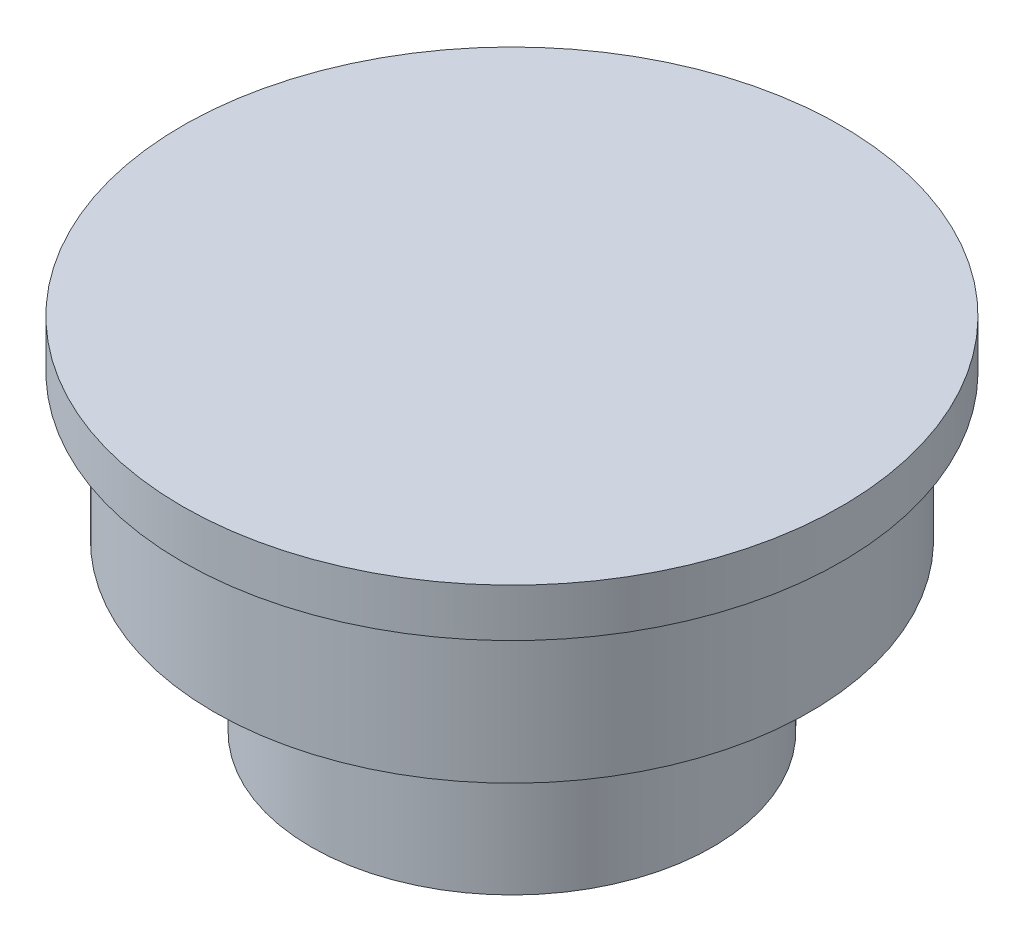
ISO-10303-21;
HEADER;
FILE_DESCRIPTION(('STEP AP214'),'2;1');
FILE_NAME('part.step','',(''),(''),'','','');
FILE_SCHEMA(('AUTOMOTIVE_DESIGN { 1 0 10303 214 1 1 1 1 }'));
ENDSEC;
DATA;
#1=APPLICATION_CONTEXT('core data for automotive mechanical design processes');
#2=APPLICATION_PROTOCOL_DEFINITION('international standard','automotive_design',2000,#1);
#3=PRODUCT_CONTEXT('',#1,'mechanical');
#4=PRODUCT('Part','Part','',(#3));
#5=PRODUCT_RELATED_PRODUCT_CATEGORY('part','',(#4));
#6=PRODUCT_DEFINITION_FORMATION('','',#4);
#7=PRODUCT_DEFINITION_CONTEXT('part definition',#1,'design');
#8=PRODUCT_DEFINITION('design','',#6,#7);
#9=PRODUCT_DEFINITION_SHAPE('','',#8);
#10=(LENGTH_UNIT() NAMED_UNIT(*) SI_UNIT(.MILLI.,.METRE.));
#11=(NAMED_UNIT(*) PLANE_ANGLE_UNIT() SI_UNIT($,.RADIAN.));
#12=(NAMED_UNIT(*) SI_UNIT($,.STERADIAN.) SOLID_ANGLE_UNIT());
#13=UNCERTAINTY_MEASURE_WITH_UNIT(LENGTH_MEASURE(1.E-05),#10,'distance_accuracy_value','');
#14=(GEOMETRIC_REPRESENTATION_CONTEXT(3) GLOBAL_UNCERTAINTY_ASSIGNED_CONTEXT((#13)) GLOBAL_UNIT_ASSIGNED_CONTEXT((#10,
#11,#12)) REPRESENTATION_CONTEXT('',''));
#15=CARTESIAN_POINT('',(0.,0.,0.));
#16=DIRECTION('',(0.,0.,1.));
#17=DIRECTION('',(1.,0.,0.));
#18=AXIS2_PLACEMENT_3D('',#15,#16,#17);
#19=CARTESIAN_POINT('',(0.,0.,0.));
#20=DIRECTION('',(0.,1.,0.));
#21=DIRECTION('',(0.,0.,1.));
#22=AXIS2_PLACEMENT_3D('',#19,#20,#21);
#23=PLANE('',#22);
#24=CARTESIAN_POINT('',(0.,0.,0.));
#25=DIRECTION('',(0.,1.,0.));
#26=DIRECTION('',(0.,0.,1.));
#27=AXIS2_PLACEMENT_3D('',#24,#25,#26);
#28=CIRCLE('',#27,12.125);
#29=CARTESIAN_POINT('',(0.,0.,12.125));
#30=VERTEX_POINT('',#29);
#31=EDGE_CURVE('E10',#30,#30,#28,.T.);
#32=ORIENTED_EDGE('',*,*,#31,.F.);
#33=EDGE_LOOP('',(#32));
#34=FACE_BOUND('',#33,.T.);
#35=ADVANCED_FACE('F31',(#34),#23,.F.);
#36=CARTESIAN_POINT('',(0.,21.7,0.));
#37=DIRECTION('',(0.,1.,0.));
#38=DIRECTION('',(0.,0.,1.));
#39=AXIS2_PLACEMENT_3D('',#36,#37,#38);
#40=CYLINDRICAL_SURFACE('',#39,12.125);
#41=CARTESIAN_POINT('',(0.,10.,0.));
#42=DIRECTION('',(0.,1.,0.));
#43=DIRECTION('',(0.,0.,1.));
#44=AXIS2_PLACEMENT_3D('',#41,#42,#43);
#45=CIRCLE('',#44,12.125);
#46=CARTESIAN_POINT('',(0.,10.,12.125));
#47=VERTEX_POINT('',#46);
#48=EDGE_CURVE('E37',#47,#47,#45,.T.);
#49=ORIENTED_EDGE('',*,*,#48,.F.);
#50=EDGE_LOOP('',(#49));
#51=FACE_BOUND('',#50,.T.);
#52=ORIENTED_EDGE('',*,*,#31,.T.);
#53=EDGE_LOOP('',(#52));
#54=FACE_BOUND('',#53,.T.);
#55=ADVANCED_FACE('F79',(#51,#54),#40,.T.);
#56=CARTESIAN_POINT('',(18.,10.,0.));
#57=DIRECTION('',(0.,1.,0.));
#58=DIRECTION('',(0.,0.,1.));
#59=AXIS2_PLACEMENT_3D('',#56,#57,#58);
#60=PLANE('',#59);
#61=CARTESIAN_POINT('',(0.,10.,0.));
#62=DIRECTION('',(0.,1.,0.));
#63=DIRECTION('',(0.,0.,1.));
#64=AXIS2_PLACEMENT_3D('',#61,#62,#63);
#65=CIRCLE('',#64,18.);
#66=CARTESIAN_POINT('',(0.,10.,18.));
#67=VERTEX_POINT('',#66);
#68=EDGE_CURVE('E41',#67,#67,#65,.T.);
#69=ORIENTED_EDGE('',*,*,#68,.F.);
#70=EDGE_LOOP('',(#69));
#71=FACE_BOUND('',#70,.T.);
#72=ORIENTED_EDGE('',*,*,#48,.T.);
#73=EDGE_LOOP('',(#72));
#74=FACE_BOUND('',#73,.T.);
#75=ADVANCED_FACE('F74',(#71,#74),#60,.F.);
#76=CARTESIAN_POINT('',(0.,21.7,0.));
#77=DIRECTION('',(0.,1.,0.));
#78=DIRECTION('',(0.,0.,1.));
#79=AXIS2_PLACEMENT_3D('',#76,#77,#78);
#80=CYLINDRICAL_SURFACE('',#79,18.);
#81=CARTESIAN_POINT('',(0.,18.8,0.));
#82=DIRECTION('',(0.,1.,0.));
#83=DIRECTION('',(0.,0.,1.));
#84=AXIS2_PLACEMENT_3D('',#81,#82,#83);
#85=CIRCLE('',#84,18.);
#86=CARTESIAN_POINT('',(0.,18.8,18.));
#87=VERTEX_POINT('',#86);
#88=EDGE_CURVE('E45',#87,#87,#85,.T.);
#89=ORIENTED_EDGE('',*,*,#88,.F.);
#90=EDGE_LOOP('',(#89));
#91=FACE_BOUND('',#90,.T.);
#92=ORIENTED_EDGE('',*,*,#68,.T.);
#93=EDGE_LOOP('',(#92));
#94=FACE_BOUND('',#93,.T.);
#95=ADVANCED_FACE('F68',(#91,#94),#80,.T.);
#96=CARTESIAN_POINT('',(19.9,18.8,0.));
#97=DIRECTION('',(0.,1.,0.));
#98=DIRECTION('',(0.,0.,1.));
#99=AXIS2_PLACEMENT_3D('',#96,#97,#98);
#100=PLANE('',#99);
#101=CARTESIAN_POINT('',(0.,18.8,0.));
#102=DIRECTION('',(0.,1.,0.));
#103=DIRECTION('',(0.,0.,1.));
#104=AXIS2_PLACEMENT_3D('',#101,#102,#103);
#105=CIRCLE('',#104,19.9);
#106=CARTESIAN_POINT('',(0.,18.8,19.9));
#107=VERTEX_POINT('',#106);
#108=EDGE_CURVE('E50',#107,#107,#105,.T.);
#109=ORIENTED_EDGE('',*,*,#108,.F.);
#110=EDGE_LOOP('',(#109));
#111=FACE_BOUND('',#110,.T.);
#112=ORIENTED_EDGE('',*,*,#88,.T.);
#113=EDGE_LOOP('',(#112));
#114=FACE_BOUND('',#113,.T.);
#115=ADVANCED_FACE('F62',(#111,#114),#100,.F.);
#116=CARTESIAN_POINT('',(0.,21.7,0.));
#117=DIRECTION('',(0.,1.,0.));
#118=DIRECTION('',(0.,0.,1.));
#119=AXIS2_PLACEMENT_3D('',#116,#117,#118);
#120=CYLINDRICAL_SURFACE('',#119,19.9);
#121=CARTESIAN_POINT('',(0.,21.7,0.));
#122=DIRECTION('',(0.,1.,0.));
#123=DIRECTION('',(0.,0.,1.));
#124=AXIS2_PLACEMENT_3D('',#121,#122,#123);
#125=CIRCLE('',#124,19.9);
#126=CARTESIAN_POINT('',(0.,21.7,19.9));
#127=VERTEX_POINT('',#126);
#128=EDGE_CURVE('E53',#127,#127,#125,.T.);
#129=ORIENTED_EDGE('',*,*,#128,.F.);
#130=EDGE_LOOP('',(#129));
#131=FACE_BOUND('',#130,.T.);
#132=ORIENTED_EDGE('',*,*,#108,.T.);
#133=EDGE_LOOP('',(#132));
#134=FACE_BOUND('',#133,.T.);
#135=ADVANCED_FACE('F59',(#131,#134),#120,.T.);
#136=CARTESIAN_POINT('',(19.9,21.7,0.));
#137=DIRECTION('',(0.,-1.,0.));
#138=DIRECTION('',(0.,0.,-1.));
#139=AXIS2_PLACEMENT_3D('',#136,#137,#138);
#140=PLANE('',#139);
#141=ORIENTED_EDGE('',*,*,#128,.T.);
#142=EDGE_LOOP('',(#141));
#143=FACE_BOUND('',#142,.T.);
#144=ADVANCED_FACE('F57',(#143),#140,.F.);
#145=CLOSED_SHELL('',(#35,#55,#75,#95,#115,#135,#144));
#146=MANIFOLD_SOLID_BREP('B2',#145);
#147=ADVANCED_BREP_SHAPE_REPRESENTATION('',(#18,#146),#14);
#148=SHAPE_DEFINITION_REPRESENTATION(#9,#147);
ENDSEC;
END-ISO-10303-21;
